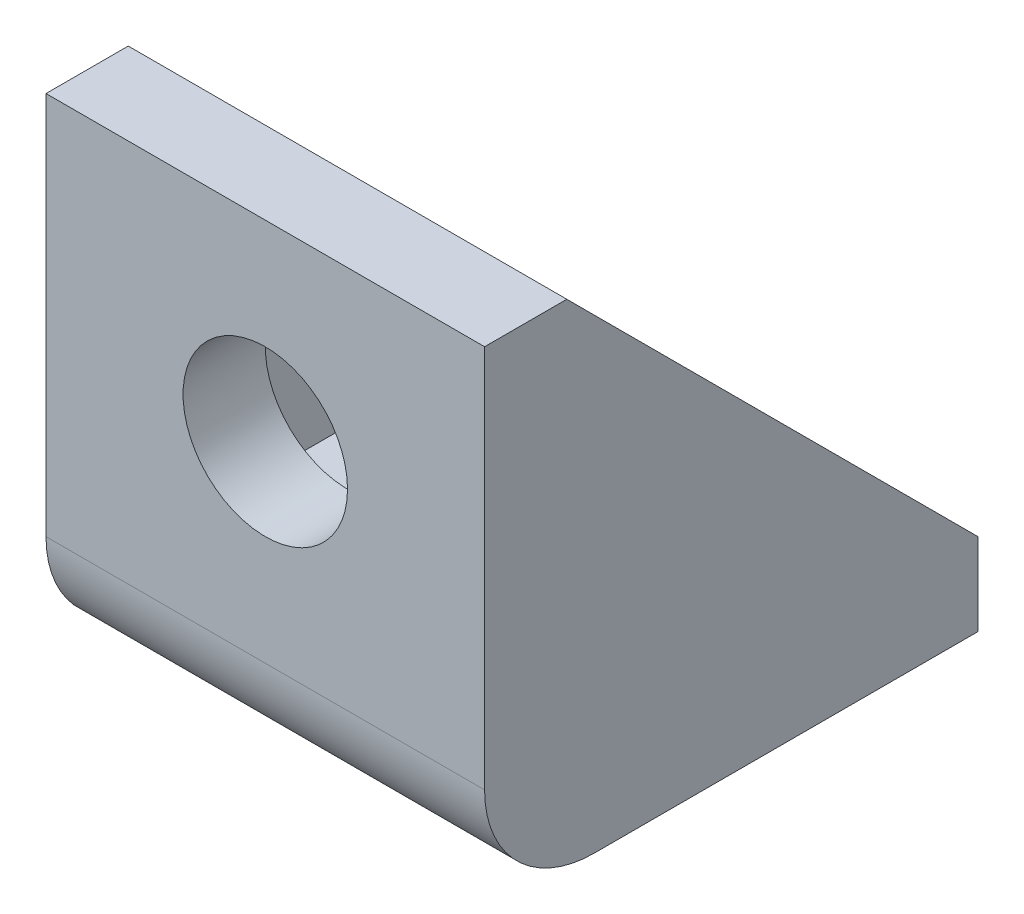
ISO-10303-21;
HEADER;
FILE_DESCRIPTION(('STEP AP214'),'2;1');
FILE_NAME('part.step','',(''),(''),'','','');
FILE_SCHEMA(('AUTOMOTIVE_DESIGN { 1 0 10303 214 1 1 1 1 }'));
ENDSEC;
DATA;
#1=APPLICATION_CONTEXT('core data for automotive mechanical design processes');
#2=APPLICATION_PROTOCOL_DEFINITION('international standard','automotive_design',2000,#1);
#3=PRODUCT_CONTEXT('',#1,'mechanical');
#4=PRODUCT('Part','Part','',(#3));
#5=PRODUCT_RELATED_PRODUCT_CATEGORY('part','',(#4));
#6=PRODUCT_DEFINITION_FORMATION('','',#4);
#7=PRODUCT_DEFINITION_CONTEXT('part definition',#1,'design');
#8=PRODUCT_DEFINITION('design','',#6,#7);
#9=PRODUCT_DEFINITION_SHAPE('','',#8);
#10=(LENGTH_UNIT() NAMED_UNIT(*) SI_UNIT(.MILLI.,.METRE.));
#11=(NAMED_UNIT(*) PLANE_ANGLE_UNIT() SI_UNIT($,.RADIAN.));
#12=(NAMED_UNIT(*) SI_UNIT($,.STERADIAN.) SOLID_ANGLE_UNIT());
#13=UNCERTAINTY_MEASURE_WITH_UNIT(LENGTH_MEASURE(1.E-05),#10,'distance_accuracy_value','');
#14=(GEOMETRIC_REPRESENTATION_CONTEXT(3) GLOBAL_UNCERTAINTY_ASSIGNED_CONTEXT((#13)) GLOBAL_UNIT_ASSIGNED_CONTEXT((#10,
#11,#12)) REPRESENTATION_CONTEXT('',''));
#15=CARTESIAN_POINT('',(0.,0.,0.));
#16=DIRECTION('',(0.,0.,1.));
#17=DIRECTION('',(1.,0.,0.));
#18=AXIS2_PLACEMENT_3D('',#15,#16,#17);
#19=CARTESIAN_POINT('',(4.,1.5,0.));
#20=DIRECTION('',(0.,1.,0.));
#21=DIRECTION('',(0.,0.,1.));
#22=AXIS2_PLACEMENT_3D('',#19,#20,#21);
#23=PLANE('',#22);
#24=CARTESIAN_POINT('',(0.,1.5,-5.5));
#25=DIRECTION('',(0.,1.,0.));
#26=DIRECTION('',(0.,0.,1.));
#27=AXIS2_PLACEMENT_3D('',#24,#25,#26);
#28=CIRCLE('',#27,1.5);
#29=CARTESIAN_POINT('',(0.,1.5,-4.));
#30=VERTEX_POINT('',#29);
#31=EDGE_CURVE('E221',#30,#30,#28,.T.);
#32=ORIENTED_EDGE('',*,*,#31,.F.);
#33=EDGE_LOOP('',(#32));
#34=FACE_BOUND('',#33,.T.);
#35=DIRECTION('',(0.,0.,-1.));
#36=VECTOR('',#35,1.);
#37=CARTESIAN_POINT('',(-3.5,1.5,-1.5));
#38=LINE('',#37,#36);
#39=CARTESIAN_POINT('',(-3.5,1.5,-1.5));
#40=VERTEX_POINT('',#39);
#41=CARTESIAN_POINT('',(-3.5,1.5,-9.));
#42=VERTEX_POINT('',#41);
#43=EDGE_CURVE('E114',#40,#42,#38,.T.);
#44=ORIENTED_EDGE('',*,*,#43,.F.);
#45=DIRECTION('',(-1.,0.,0.));
#46=VECTOR('',#45,1.);
#47=CARTESIAN_POINT('',(4.,1.5,-1.5));
#48=LINE('',#47,#46);
#49=CARTESIAN_POINT('',(3.5,1.5,-1.5));
#50=VERTEX_POINT('',#49);
#51=EDGE_CURVE('E135',#50,#40,#48,.T.);
#52=ORIENTED_EDGE('',*,*,#51,.F.);
#53=DIRECTION('',(0.,0.,-1.));
#54=VECTOR('',#53,1.);
#55=CARTESIAN_POINT('',(3.5,1.5,-1.5));
#56=LINE('',#55,#54);
#57=CARTESIAN_POINT('',(3.5,1.5,-9.));
#58=VERTEX_POINT('',#57);
#59=EDGE_CURVE('E193',#50,#58,#56,.T.);
#60=ORIENTED_EDGE('',*,*,#59,.T.);
#61=DIRECTION('',(-1.,0.,0.));
#62=VECTOR('',#61,1.);
#63=CARTESIAN_POINT('',(4.,1.5,-9.));
#64=LINE('',#63,#62);
#65=EDGE_CURVE('E176',#58,#42,#64,.T.);
#66=ORIENTED_EDGE('',*,*,#65,.T.);
#67=EDGE_LOOP('',(#44,#52,#60,#66));
#68=FACE_BOUND('',#67,.T.);
#69=ADVANCED_FACE('F40',(#34,#68),#23,.T.);
#70=CARTESIAN_POINT('',(4.,0.,-1.5));
#71=DIRECTION('',(0.,0.,1.));
#72=DIRECTION('',(1.,0.,0.));
#73=AXIS2_PLACEMENT_3D('',#70,#71,#72);
#74=PLANE('',#73);
#75=CARTESIAN_POINT('',(0.,5.5,-1.5));
#76=DIRECTION('',(0.,0.,1.));
#77=DIRECTION('',(1.,0.,0.));
#78=AXIS2_PLACEMENT_3D('',#75,#76,#77);
#79=CIRCLE('',#78,1.5);
#80=CARTESIAN_POINT('',(1.5,5.5,-1.5));
#81=VERTEX_POINT('',#80);
#82=EDGE_CURVE('E214',#81,#81,#79,.T.);
#83=ORIENTED_EDGE('',*,*,#82,.T.);
#84=EDGE_LOOP('',(#83));
#85=FACE_BOUND('',#84,.T.);
#86=ORIENTED_EDGE('',*,*,#51,.T.);
#87=DIRECTION('',(0.,-1.,0.));
#88=VECTOR('',#87,1.);
#89=CARTESIAN_POINT('',(-3.5,1.5,-1.5));
#90=LINE('',#89,#88);
#91=CARTESIAN_POINT('',(-3.5,9.,-1.5));
#92=VERTEX_POINT('',#91);
#93=EDGE_CURVE('E112',#92,#40,#90,.T.);
#94=ORIENTED_EDGE('',*,*,#93,.F.);
#95=DIRECTION('',(-1.,0.,0.));
#96=VECTOR('',#95,1.);
#97=CARTESIAN_POINT('',(4.,9.,-1.5));
#98=LINE('',#97,#96);
#99=CARTESIAN_POINT('',(3.5,9.,-1.5));
#100=VERTEX_POINT('',#99);
#101=EDGE_CURVE('E132',#100,#92,#98,.T.);
#102=ORIENTED_EDGE('',*,*,#101,.F.);
#103=DIRECTION('',(0.,-1.,0.));
#104=VECTOR('',#103,1.);
#105=CARTESIAN_POINT('',(3.5,1.5,-1.5));
#106=LINE('',#105,#104);
#107=EDGE_CURVE('E197',#100,#50,#106,.T.);
#108=ORIENTED_EDGE('',*,*,#107,.T.);
#109=EDGE_LOOP('',(#86,#94,#102,#108));
#110=FACE_BOUND('',#109,.T.);
#111=ADVANCED_FACE('F131',(#85,#110),#74,.F.);
#112=CARTESIAN_POINT('',(4.,9.,0.));
#113=DIRECTION('',(0.,1.,0.));
#114=DIRECTION('',(0.,0.,1.));
#115=AXIS2_PLACEMENT_3D('',#112,#113,#114);
#116=PLANE('',#115);
#117=DIRECTION('',(0.,0.,-1.));
#118=VECTOR('',#117,1.);
#119=CARTESIAN_POINT('',(-4.,9.,0.));
#120=LINE('',#119,#118);
#121=CARTESIAN_POINT('',(-4.,9.,0.));
#122=VERTEX_POINT('',#121);
#123=CARTESIAN_POINT('',(-4.,9.,-1.5));
#124=VERTEX_POINT('',#123);
#125=EDGE_CURVE('E170',#122,#124,#120,.T.);
#126=ORIENTED_EDGE('',*,*,#125,.F.);
#127=DIRECTION('',(-1.,0.,0.));
#128=VECTOR('',#127,1.);
#129=CARTESIAN_POINT('',(4.,9.,0.));
#130=LINE('',#129,#128);
#131=CARTESIAN_POINT('',(4.,9.,0.));
#132=VERTEX_POINT('',#131);
#133=EDGE_CURVE('E141',#132,#122,#130,.T.);
#134=ORIENTED_EDGE('',*,*,#133,.F.);
#135=DIRECTION('',(0.,0.,-1.));
#136=VECTOR('',#135,1.);
#137=CARTESIAN_POINT('',(4.,9.,0.));
#138=LINE('',#137,#136);
#139=CARTESIAN_POINT('',(4.,9.,-1.5));
#140=VERTEX_POINT('',#139);
#141=EDGE_CURVE('E168',#132,#140,#138,.T.);
#142=ORIENTED_EDGE('',*,*,#141,.T.);
#143=EDGE_CURVE('E139',#140,#100,#98,.T.);
#144=ORIENTED_EDGE('',*,*,#143,.T.);
#145=ORIENTED_EDGE('',*,*,#101,.T.);
#146=DIRECTION('',(-1.,0.,0.));
#147=VECTOR('',#146,1.);
#148=CARTESIAN_POINT('',(-3.5,9.,-1.5));
#149=LINE('',#148,#147);
#150=EDGE_CURVE('E120',#92,#124,#149,.T.);
#151=ORIENTED_EDGE('',*,*,#150,.T.);
#152=EDGE_LOOP('',(#126,#134,#142,#144,#145,#151));
#153=FACE_BOUND('',#152,.T.);
#154=ADVANCED_FACE('F137',(#153),#116,.T.);
#155=CARTESIAN_POINT('',(4.,0.,0.));
#156=DIRECTION('',(0.,0.,1.));
#157=DIRECTION('',(1.,0.,0.));
#158=AXIS2_PLACEMENT_3D('',#155,#156,#157);
#159=PLANE('',#158);
#160=CARTESIAN_POINT('',(0.,5.5,0.));
#161=DIRECTION('',(0.,0.,1.));
#162=DIRECTION('',(1.,0.,0.));
#163=AXIS2_PLACEMENT_3D('',#160,#161,#162);
#164=CIRCLE('',#163,1.5);
#165=CARTESIAN_POINT('',(1.5,5.5,0.));
#166=VERTEX_POINT('',#165);
#167=EDGE_CURVE('E218',#166,#166,#164,.T.);
#168=ORIENTED_EDGE('',*,*,#167,.F.);
#169=EDGE_LOOP('',(#168));
#170=FACE_BOUND('',#169,.T.);
#171=DIRECTION('',(0.,1.,0.));
#172=VECTOR('',#171,1.);
#173=CARTESIAN_POINT('',(-4.,0.,0.));
#174=LINE('',#173,#172);
#175=CARTESIAN_POINT('',(-4.,2.,0.));
#176=VERTEX_POINT('',#175);
#177=EDGE_CURVE('E166',#176,#122,#174,.T.);
#178=ORIENTED_EDGE('',*,*,#177,.F.);
#179=DIRECTION('',(-1.,0.,0.));
#180=VECTOR('',#179,1.);
#181=CARTESIAN_POINT('',(4.,2.,0.));
#182=LINE('',#181,#180);
#183=CARTESIAN_POINT('',(4.,2.,0.));
#184=VERTEX_POINT('',#183);
#185=EDGE_CURVE('E48',#176,#184,#182,.F.);
#186=ORIENTED_EDGE('',*,*,#185,.T.);
#187=DIRECTION('',(0.,1.,0.));
#188=VECTOR('',#187,1.);
#189=CARTESIAN_POINT('',(4.,0.,0.));
#190=LINE('',#189,#188);
#191=EDGE_CURVE('E188',#184,#132,#190,.T.);
#192=ORIENTED_EDGE('',*,*,#191,.T.);
#193=ORIENTED_EDGE('',*,*,#133,.T.);
#194=EDGE_LOOP('',(#178,#186,#192,#193));
#195=FACE_BOUND('',#194,.T.);
#196=ADVANCED_FACE('F204',(#170,#195),#159,.T.);
#197=CARTESIAN_POINT('',(4.,0.,0.));
#198=DIRECTION('',(0.,1.,0.));
#199=DIRECTION('',(0.,0.,1.));
#200=AXIS2_PLACEMENT_3D('',#197,#198,#199);
#201=PLANE('',#200);
#202=CARTESIAN_POINT('',(0.,0.,-5.5));
#203=DIRECTION('',(0.,-1.,0.));
#204=DIRECTION('',(0.,0.,-1.));
#205=AXIS2_PLACEMENT_3D('',#202,#203,#204);
#206=CIRCLE('',#205,1.5);
#207=CARTESIAN_POINT('',(0.,0.,-7.));
#208=VERTEX_POINT('',#207);
#209=EDGE_CURVE('E224',#208,#208,#206,.T.);
#210=ORIENTED_EDGE('',*,*,#209,.F.);
#211=EDGE_LOOP('',(#210));
#212=FACE_BOUND('',#211,.T.);
#213=DIRECTION('',(0.,0.,-1.));
#214=VECTOR('',#213,1.);
#215=CARTESIAN_POINT('',(4.,0.,0.));
#216=LINE('',#215,#214);
#217=CARTESIAN_POINT('',(4.,0.,-2.));
#218=VERTEX_POINT('',#217);
#219=CARTESIAN_POINT('',(4.,0.,-9.));
#220=VERTEX_POINT('',#219);
#221=EDGE_CURVE('E159',#218,#220,#216,.T.);
#222=ORIENTED_EDGE('',*,*,#221,.F.);
#223=DIRECTION('',(-1.,0.,0.));
#224=VECTOR('',#223,1.);
#225=CARTESIAN_POINT('',(-4.,0.,-2.));
#226=LINE('',#225,#224);
#227=CARTESIAN_POINT('',(-4.,0.,-2.));
#228=VERTEX_POINT('',#227);
#229=EDGE_CURVE('E149',#218,#228,#226,.T.);
#230=ORIENTED_EDGE('',*,*,#229,.T.);
#231=DIRECTION('',(0.,0.,-1.));
#232=VECTOR('',#231,1.);
#233=CARTESIAN_POINT('',(-4.,0.,0.));
#234=LINE('',#233,#232);
#235=CARTESIAN_POINT('',(-4.,0.,-9.));
#236=VERTEX_POINT('',#235);
#237=EDGE_CURVE('E157',#228,#236,#234,.T.);
#238=ORIENTED_EDGE('',*,*,#237,.T.);
#239=DIRECTION('',(-1.,0.,0.));
#240=VECTOR('',#239,1.);
#241=CARTESIAN_POINT('',(4.,0.,-9.));
#242=LINE('',#241,#240);
#243=EDGE_CURVE('E144',#220,#236,#242,.T.);
#244=ORIENTED_EDGE('',*,*,#243,.F.);
#245=EDGE_LOOP('',(#222,#230,#238,#244));
#246=FACE_BOUND('',#245,.T.);
#247=ADVANCED_FACE('F155',(#212,#246),#201,.F.);
#248=CARTESIAN_POINT('',(4.,0.,-9.));
#249=DIRECTION('',(0.,0.,1.));
#250=DIRECTION('',(1.,0.,0.));
#251=AXIS2_PLACEMENT_3D('',#248,#249,#250);
#252=PLANE('',#251);
#253=DIRECTION('',(0.,1.,0.));
#254=VECTOR('',#253,1.);
#255=CARTESIAN_POINT('',(-4.,0.,-9.));
#256=LINE('',#255,#254);
#257=CARTESIAN_POINT('',(-4.,1.5,-9.));
#258=VERTEX_POINT('',#257);
#259=EDGE_CURVE('E165',#236,#258,#256,.T.);
#260=ORIENTED_EDGE('',*,*,#259,.T.);
#261=DIRECTION('',(-1.,0.,0.));
#262=VECTOR('',#261,1.);
#263=CARTESIAN_POINT('',(-3.5,1.5,-9.));
#264=LINE('',#263,#262);
#265=EDGE_CURVE('E127',#42,#258,#264,.T.);
#266=ORIENTED_EDGE('',*,*,#265,.F.);
#267=ORIENTED_EDGE('',*,*,#65,.F.);
#268=CARTESIAN_POINT('',(4.,1.5,-9.));
#269=VERTEX_POINT('',#268);
#270=EDGE_CURVE('E174',#269,#58,#64,.T.);
#271=ORIENTED_EDGE('',*,*,#270,.F.);
#272=DIRECTION('',(0.,1.,0.));
#273=VECTOR('',#272,1.);
#274=CARTESIAN_POINT('',(4.,0.,-9.));
#275=LINE('',#274,#273);
#276=EDGE_CURVE('E181',#220,#269,#275,.T.);
#277=ORIENTED_EDGE('',*,*,#276,.F.);
#278=ORIENTED_EDGE('',*,*,#243,.T.);
#279=EDGE_LOOP('',(#260,#266,#267,#271,#277,#278));
#280=FACE_BOUND('',#279,.T.);
#281=ADVANCED_FACE('F179',(#280),#252,.F.);
#282=CARTESIAN_POINT('',(4.,0.,0.));
#283=DIRECTION('',(1.,0.,0.));
#284=DIRECTION('',(0.,0.,-1.));
#285=AXIS2_PLACEMENT_3D('',#282,#283,#284);
#286=PLANE('',#285);
#287=ORIENTED_EDGE('',*,*,#191,.F.);
#288=CARTESIAN_POINT('',(4.,2.,-2.));
#289=DIRECTION('',(1.,0.,0.));
#290=DIRECTION('',(0.,0.,-1.));
#291=AXIS2_PLACEMENT_3D('',#288,#289,#290);
#292=CIRCLE('',#291,2.);
#293=EDGE_CURVE('E11',#184,#218,#292,.T.);
#294=ORIENTED_EDGE('',*,*,#293,.T.);
#295=ORIENTED_EDGE('',*,*,#221,.T.);
#296=ORIENTED_EDGE('',*,*,#276,.T.);
#297=DIRECTION('',(0.,0.707106781186547,0.707106781186547));
#298=VECTOR('',#297,1.);
#299=CARTESIAN_POINT('',(4.,9.,-1.5));
#300=LINE('',#299,#298);
#301=EDGE_CURVE('E201',#269,#140,#300,.T.);
#302=ORIENTED_EDGE('',*,*,#301,.T.);
#303=ORIENTED_EDGE('',*,*,#141,.F.);
#304=EDGE_LOOP('',(#287,#294,#295,#296,#302,#303));
#305=FACE_BOUND('',#304,.T.);
#306=ADVANCED_FACE('F206',(#305),#286,.T.);
#307=CARTESIAN_POINT('',(-4.,0.,0.));
#308=DIRECTION('',(1.,0.,0.));
#309=DIRECTION('',(0.,0.,-1.));
#310=AXIS2_PLACEMENT_3D('',#307,#308,#309);
#311=PLANE('',#310);
#312=ORIENTED_EDGE('',*,*,#237,.F.);
#313=CARTESIAN_POINT('',(-4.,2.,-2.));
#314=DIRECTION('',(1.,0.,0.));
#315=DIRECTION('',(0.,0.,-1.));
#316=AXIS2_PLACEMENT_3D('',#313,#314,#315);
#317=CIRCLE('',#316,2.);
#318=EDGE_CURVE('E62',#228,#176,#317,.F.);
#319=ORIENTED_EDGE('',*,*,#318,.T.);
#320=ORIENTED_EDGE('',*,*,#177,.T.);
#321=ORIENTED_EDGE('',*,*,#125,.T.);
#322=DIRECTION('',(0.,0.707106781186547,0.707106781186547));
#323=VECTOR('',#322,1.);
#324=CARTESIAN_POINT('',(-4.,9.,-1.5));
#325=LINE('',#324,#323);
#326=EDGE_CURVE('E122',#258,#124,#325,.T.);
#327=ORIENTED_EDGE('',*,*,#326,.F.);
#328=ORIENTED_EDGE('',*,*,#259,.F.);
#329=EDGE_LOOP('',(#312,#319,#320,#321,#327,#328));
#330=FACE_BOUND('',#329,.T.);
#331=ADVANCED_FACE('F163',(#330),#311,.F.);
#332=CARTESIAN_POINT('',(3.5,9.,-1.5));
#333=DIRECTION('',(0.,0.707106781186547,-0.707106781186547));
#334=DIRECTION('',(0.,0.707106781186548,0.707106781186548));
#335=AXIS2_PLACEMENT_3D('',#332,#333,#334);
#336=PLANE('',#335);
#337=ORIENTED_EDGE('',*,*,#301,.F.);
#338=ORIENTED_EDGE('',*,*,#270,.T.);
#339=DIRECTION('',(0.,0.707106781186547,0.707106781186547));
#340=VECTOR('',#339,1.);
#341=CARTESIAN_POINT('',(3.5,9.,-1.5));
#342=LINE('',#341,#340);
#343=EDGE_CURVE('E191',#58,#100,#342,.T.);
#344=ORIENTED_EDGE('',*,*,#343,.T.);
#345=ORIENTED_EDGE('',*,*,#143,.F.);
#346=EDGE_LOOP('',(#337,#338,#344,#345));
#347=FACE_BOUND('',#346,.T.);
#348=ADVANCED_FACE('F207',(#347),#336,.T.);
#349=CARTESIAN_POINT('',(3.5,0.,0.));
#350=DIRECTION('',(-1.,0.,0.));
#351=DIRECTION('',(0.,0.,1.));
#352=AXIS2_PLACEMENT_3D('',#349,#350,#351);
#353=PLANE('',#352);
#354=ORIENTED_EDGE('',*,*,#107,.F.);
#355=ORIENTED_EDGE('',*,*,#343,.F.);
#356=ORIENTED_EDGE('',*,*,#59,.F.);
#357=EDGE_LOOP('',(#354,#355,#356));
#358=FACE_BOUND('',#357,.T.);
#359=ADVANCED_FACE('F210',(#358),#353,.T.);
#360=CARTESIAN_POINT('',(-3.5,9.,-1.5));
#361=DIRECTION('',(0.,-0.707106781186547,0.707106781186547));
#362=DIRECTION('',(0.,-0.707106781186548,-0.707106781186548));
#363=AXIS2_PLACEMENT_3D('',#360,#361,#362);
#364=PLANE('',#363);
#365=ORIENTED_EDGE('',*,*,#326,.T.);
#366=ORIENTED_EDGE('',*,*,#150,.F.);
#367=DIRECTION('',(0.,0.707106781186547,0.707106781186547));
#368=VECTOR('',#367,1.);
#369=CARTESIAN_POINT('',(-3.5,9.,-1.5));
#370=LINE('',#369,#368);
#371=EDGE_CURVE('E108',#42,#92,#370,.T.);
#372=ORIENTED_EDGE('',*,*,#371,.F.);
#373=ORIENTED_EDGE('',*,*,#265,.T.);
#374=EDGE_LOOP('',(#365,#366,#372,#373));
#375=FACE_BOUND('',#374,.T.);
#376=ADVANCED_FACE('F121',(#375),#364,.F.);
#377=CARTESIAN_POINT('',(-3.5,0.,0.));
#378=DIRECTION('',(1.,0.,0.));
#379=DIRECTION('',(0.,0.,1.));
#380=AXIS2_PLACEMENT_3D('',#377,#378,#379);
#381=PLANE('',#380);
#382=ORIENTED_EDGE('',*,*,#93,.T.);
#383=ORIENTED_EDGE('',*,*,#43,.T.);
#384=ORIENTED_EDGE('',*,*,#371,.T.);
#385=EDGE_LOOP('',(#382,#383,#384));
#386=FACE_BOUND('',#385,.T.);
#387=ADVANCED_FACE('F110',(#386),#381,.T.);
#388=CARTESIAN_POINT('',(0.,5.5,-9.));
#389=DIRECTION('',(0.,0.,1.));
#390=DIRECTION('',(1.,0.,0.));
#391=AXIS2_PLACEMENT_3D('',#388,#389,#390);
#392=CYLINDRICAL_SURFACE('',#391,1.5);
#393=ORIENTED_EDGE('',*,*,#167,.T.);
#394=EDGE_LOOP('',(#393));
#395=FACE_BOUND('',#394,.T.);
#396=ORIENTED_EDGE('',*,*,#82,.F.);
#397=EDGE_LOOP('',(#396));
#398=FACE_BOUND('',#397,.T.);
#399=ADVANCED_FACE('F306',(#395,#398),#392,.F.);
#400=CARTESIAN_POINT('',(0.,9.,-5.5));
#401=DIRECTION('',(0.,-1.,0.));
#402=DIRECTION('',(0.,0.,-1.));
#403=AXIS2_PLACEMENT_3D('',#400,#401,#402);
#404=CYLINDRICAL_SURFACE('',#403,1.5);
#405=ORIENTED_EDGE('',*,*,#31,.T.);
#406=EDGE_LOOP('',(#405));
#407=FACE_BOUND('',#406,.T.);
#408=ORIENTED_EDGE('',*,*,#209,.T.);
#409=EDGE_LOOP('',(#408));
#410=FACE_BOUND('',#409,.T.);
#411=ADVANCED_FACE('F228',(#407,#410),#404,.F.);
#412=CARTESIAN_POINT('',(4.,2.,-2.));
#413=DIRECTION('',(1.,0.,0.));
#414=DIRECTION('',(0.,0.,-1.));
#415=AXIS2_PLACEMENT_3D('',#412,#413,#414);
#416=CYLINDRICAL_SURFACE('',#415,2.);
#417=ORIENTED_EDGE('',*,*,#293,.F.);
#418=ORIENTED_EDGE('',*,*,#185,.F.);
#419=ORIENTED_EDGE('',*,*,#318,.F.);
#420=ORIENTED_EDGE('',*,*,#229,.F.);
#421=EDGE_LOOP('',(#417,#418,#419,#420));
#422=FACE_BOUND('',#421,.T.);
#423=ADVANCED_FACE('F42',(#422),#416,.T.);
#424=CLOSED_SHELL('',(#69,#111,#154,#196,#247,#281,#306,#331,#348,#359,#376,#387,#399,#411,#423));
#425=MANIFOLD_SOLID_BREP('B2',#424);
#426=ADVANCED_BREP_SHAPE_REPRESENTATION('',(#18,#425),#14);
#427=SHAPE_DEFINITION_REPRESENTATION(#9,#426);
ENDSEC;
END-ISO-10303-21;
